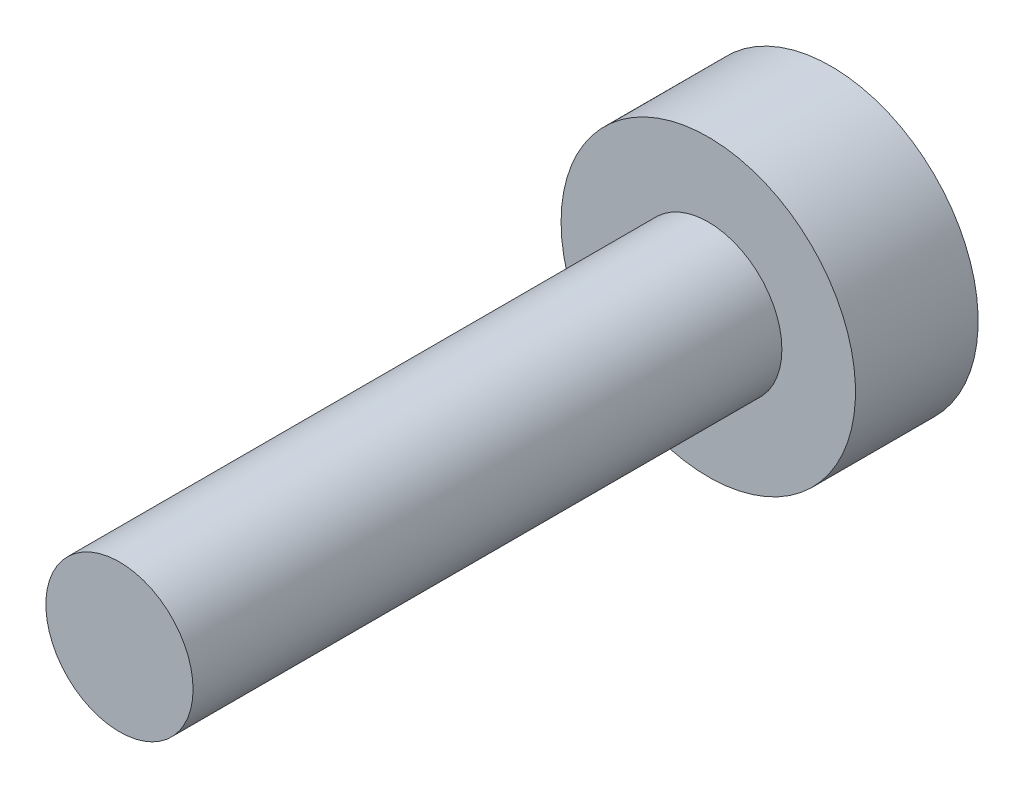
ISO-10303-21;
HEADER;
FILE_DESCRIPTION(('STEP AP214'),'2;1');
FILE_NAME('part.step','',(''),(''),'','','');
FILE_SCHEMA(('AUTOMOTIVE_DESIGN { 1 0 10303 214 1 1 1 1 }'));
ENDSEC;
DATA;
#1=APPLICATION_CONTEXT('core data for automotive mechanical design processes');
#2=APPLICATION_PROTOCOL_DEFINITION('international standard','automotive_design',2000,#1);
#3=PRODUCT_CONTEXT('',#1,'mechanical');
#4=PRODUCT('Part','Part','',(#3));
#5=PRODUCT_RELATED_PRODUCT_CATEGORY('part','',(#4));
#6=PRODUCT_DEFINITION_FORMATION('','',#4);
#7=PRODUCT_DEFINITION_CONTEXT('part definition',#1,'design');
#8=PRODUCT_DEFINITION('design','',#6,#7);
#9=PRODUCT_DEFINITION_SHAPE('','',#8);
#10=(LENGTH_UNIT() NAMED_UNIT(*) SI_UNIT(.MILLI.,.METRE.));
#11=(NAMED_UNIT(*) PLANE_ANGLE_UNIT() SI_UNIT($,.RADIAN.));
#12=(NAMED_UNIT(*) SI_UNIT($,.STERADIAN.) SOLID_ANGLE_UNIT());
#13=UNCERTAINTY_MEASURE_WITH_UNIT(LENGTH_MEASURE(1.E-05),#10,'distance_accuracy_value','');
#14=(GEOMETRIC_REPRESENTATION_CONTEXT(3) GLOBAL_UNCERTAINTY_ASSIGNED_CONTEXT((#13)) GLOBAL_UNIT_ASSIGNED_CONTEXT((#10,
#11,#12)) REPRESENTATION_CONTEXT('',''));
#15=CARTESIAN_POINT('',(0.,0.,0.));
#16=DIRECTION('',(0.,0.,1.));
#17=DIRECTION('',(1.,0.,0.));
#18=AXIS2_PLACEMENT_3D('',#15,#16,#17);
#19=CARTESIAN_POINT('',(-5.94411211869931,3.00621762325022,12.));
#20=DIRECTION('',(0.,0.,-1.));
#21=DIRECTION('',(-1.,0.,0.));
#22=AXIS2_PLACEMENT_3D('',#19,#20,#21);
#23=CYLINDRICAL_SURFACE('',#22,1.5);
#24=CARTESIAN_POINT('',(-5.94411211869931,3.00621762325022,12.));
#25=DIRECTION('',(0.,0.,1.));
#26=DIRECTION('',(1.,0.,0.));
#27=AXIS2_PLACEMENT_3D('',#24,#25,#26);
#28=CIRCLE('',#27,1.5);
#29=CARTESIAN_POINT('',(-4.44411211869931,3.00621762325022,12.));
#30=VERTEX_POINT('',#29);
#31=EDGE_CURVE('E11',#30,#30,#28,.T.);
#32=ORIENTED_EDGE('',*,*,#31,.F.);
#33=EDGE_LOOP('',(#32));
#34=FACE_BOUND('',#33,.T.);
#35=CARTESIAN_POINT('',(-5.94411211869931,3.00621762325022,0.));
#36=DIRECTION('',(0.,0.,1.));
#37=DIRECTION('',(1.,0.,0.));
#38=AXIS2_PLACEMENT_3D('',#35,#36,#37);
#39=CIRCLE('',#38,1.5);
#40=CARTESIAN_POINT('',(-4.44411211869931,3.00621762325022,0.));
#41=VERTEX_POINT('',#40);
#42=EDGE_CURVE('E36',#41,#41,#39,.T.);
#43=ORIENTED_EDGE('',*,*,#42,.T.);
#44=EDGE_LOOP('',(#43));
#45=FACE_BOUND('',#44,.T.);
#46=ADVANCED_FACE('F33',(#34,#45),#23,.T.);
#47=CARTESIAN_POINT('',(-5.94411211869931,3.00621762325022,12.));
#48=DIRECTION('',(0.,0.,1.));
#49=DIRECTION('',(1.,0.,0.));
#50=AXIS2_PLACEMENT_3D('',#47,#48,#49);
#51=PLANE('',#50);
#52=ORIENTED_EDGE('',*,*,#31,.T.);
#53=EDGE_LOOP('',(#52));
#54=FACE_BOUND('',#53,.T.);
#55=ADVANCED_FACE('F229',(#54),#51,.T.);
#56=CARTESIAN_POINT('',(-5.94411211869931,3.00621762325022,-2.5));
#57=DIRECTION('',(0.,0.,1.));
#58=DIRECTION('',(1.,0.,0.));
#59=AXIS2_PLACEMENT_3D('',#56,#57,#58);
#60=CYLINDRICAL_SURFACE('',#59,3.);
#61=CARTESIAN_POINT('',(-5.94411211869931,3.00621762325022,-2.5));
#62=DIRECTION('',(0.,0.,-1.));
#63=DIRECTION('',(-1.,0.,0.));
#64=AXIS2_PLACEMENT_3D('',#61,#62,#63);
#65=CIRCLE('',#64,3.);
#66=CARTESIAN_POINT('',(-8.94411211869931,3.00621762325022,-2.5));
#67=VERTEX_POINT('',#66);
#68=EDGE_CURVE('E204',#67,#67,#65,.T.);
#69=ORIENTED_EDGE('',*,*,#68,.F.);
#70=EDGE_LOOP('',(#69));
#71=FACE_BOUND('',#70,.T.);
#72=CARTESIAN_POINT('',(-5.94411211869931,3.00621762325022,0.));
#73=DIRECTION('',(0.,0.,-1.));
#74=DIRECTION('',(-1.,0.,0.));
#75=AXIS2_PLACEMENT_3D('',#72,#73,#74);
#76=CIRCLE('',#75,3.);
#77=CARTESIAN_POINT('',(-8.94411211869931,3.00621762325022,0.));
#78=VERTEX_POINT('',#77);
#79=EDGE_CURVE('E186',#78,#78,#76,.T.);
#80=ORIENTED_EDGE('',*,*,#79,.T.);
#81=EDGE_LOOP('',(#80));
#82=FACE_BOUND('',#81,.T.);
#83=ADVANCED_FACE('F210',(#71,#82),#60,.T.);
#84=CARTESIAN_POINT('',(-5.94411211869931,3.00621762325022,-2.5));
#85=DIRECTION('',(0.,0.,-1.));
#86=DIRECTION('',(-1.,0.,0.));
#87=AXIS2_PLACEMENT_3D('',#84,#85,#86);
#88=PLANE('',#87);
#89=DIRECTION('',(0.,-1.,0.));
#90=VECTOR('',#89,1.);
#91=CARTESIAN_POINT('',(-3.94411211869931,3.25621762325022,-2.5));
#92=LINE('',#91,#90);
#93=CARTESIAN_POINT('',(-3.94411211869931,3.25621762325022,-2.5));
#94=VERTEX_POINT('',#93);
#95=CARTESIAN_POINT('',(-3.94411211869931,2.75621762325022,-2.5));
#96=VERTEX_POINT('',#95);
#97=EDGE_CURVE('E47',#94,#96,#92,.T.);
#98=ORIENTED_EDGE('',*,*,#97,.F.);
#99=DIRECTION('',(-1.,0.,0.));
#100=VECTOR('',#99,1.);
#101=CARTESIAN_POINT('',(-3.94411211869931,3.25621762325022,-2.5));
#102=LINE('',#101,#100);
#103=CARTESIAN_POINT('',(-5.6941121186993,3.25621762325022,-2.5));
#104=VERTEX_POINT('',#103);
#105=EDGE_CURVE('E181',#94,#104,#102,.T.);
#106=ORIENTED_EDGE('',*,*,#105,.T.);
#107=DIRECTION('',(0.,-1.,0.));
#108=VECTOR('',#107,1.);
#109=CARTESIAN_POINT('',(-5.69411211869928,5.00621762325021,-2.5));
#110=LINE('',#109,#108);
#111=CARTESIAN_POINT('',(-5.69411211869928,5.00621762325021,-2.5));
#112=VERTEX_POINT('',#111);
#113=EDGE_CURVE('E179',#112,#104,#110,.T.);
#114=ORIENTED_EDGE('',*,*,#113,.F.);
#115=DIRECTION('',(-1.,0.,0.));
#116=VECTOR('',#115,1.);
#117=CARTESIAN_POINT('',(-5.69411211869928,5.00621762325021,-2.5));
#118=LINE('',#117,#116);
#119=CARTESIAN_POINT('',(-6.19411211869928,5.00621762325022,-2.5));
#120=VERTEX_POINT('',#119);
#121=EDGE_CURVE('E129',#112,#120,#118,.T.);
#122=ORIENTED_EDGE('',*,*,#121,.T.);
#123=DIRECTION('',(0.,-1.,0.));
#124=VECTOR('',#123,1.);
#125=CARTESIAN_POINT('',(-6.19411211869928,5.00621762325022,-2.5));
#126=LINE('',#125,#124);
#127=CARTESIAN_POINT('',(-6.1941121186993,3.25621762325022,-2.5));
#128=VERTEX_POINT('',#127);
#129=EDGE_CURVE('E175',#120,#128,#126,.T.);
#130=ORIENTED_EDGE('',*,*,#129,.T.);
#131=DIRECTION('',(-1.,0.,0.));
#132=VECTOR('',#131,1.);
#133=CARTESIAN_POINT('',(-6.1941121186993,3.25621762325022,-2.5));
#134=LINE('',#133,#132);
#135=CARTESIAN_POINT('',(-7.94411211869931,3.25621762325022,-2.5));
#136=VERTEX_POINT('',#135);
#137=EDGE_CURVE('E172',#128,#136,#134,.T.);
#138=ORIENTED_EDGE('',*,*,#137,.T.);
#139=DIRECTION('',(0.,-1.,0.));
#140=VECTOR('',#139,1.);
#141=CARTESIAN_POINT('',(-7.94411211869931,3.25621762325022,-2.5));
#142=LINE('',#141,#140);
#143=CARTESIAN_POINT('',(-7.94411211869931,2.75621762325022,-2.5));
#144=VERTEX_POINT('',#143);
#145=EDGE_CURVE('E169',#136,#144,#142,.T.);
#146=ORIENTED_EDGE('',*,*,#145,.T.);
#147=DIRECTION('',(-1.,0.,0.));
#148=VECTOR('',#147,1.);
#149=CARTESIAN_POINT('',(-6.19411211869931,2.75621762325022,-2.5));
#150=LINE('',#149,#148);
#151=CARTESIAN_POINT('',(-6.19411211869931,2.75621762325022,-2.5));
#152=VERTEX_POINT('',#151);
#153=EDGE_CURVE('E166',#152,#144,#150,.T.);
#154=ORIENTED_EDGE('',*,*,#153,.F.);
#155=DIRECTION('',(0.,-1.,0.));
#156=VECTOR('',#155,1.);
#157=CARTESIAN_POINT('',(-6.19411211869931,2.75621762325022,-2.5));
#158=LINE('',#157,#156);
#159=CARTESIAN_POINT('',(-6.19411211869933,1.00621762325022,-2.5));
#160=VERTEX_POINT('',#159);
#161=EDGE_CURVE('E163',#152,#160,#158,.T.);
#162=ORIENTED_EDGE('',*,*,#161,.T.);
#163=DIRECTION('',(-1.,0.,0.));
#164=VECTOR('',#163,1.);
#165=CARTESIAN_POINT('',(-5.69411211869933,1.00621762325021,-2.5));
#166=LINE('',#165,#164);
#167=CARTESIAN_POINT('',(-5.69411211869933,1.00621762325021,-2.5));
#168=VERTEX_POINT('',#167);
#169=EDGE_CURVE('E160',#168,#160,#166,.T.);
#170=ORIENTED_EDGE('',*,*,#169,.F.);
#171=DIRECTION('',(0.,-1.,0.));
#172=VECTOR('',#171,1.);
#173=CARTESIAN_POINT('',(-5.69411211869931,2.75621762325022,-2.5));
#174=LINE('',#173,#172);
#175=CARTESIAN_POINT('',(-5.69411211869931,2.75621762325022,-2.5));
#176=VERTEX_POINT('',#175);
#177=EDGE_CURVE('E157',#176,#168,#174,.T.);
#178=ORIENTED_EDGE('',*,*,#177,.F.);
#179=DIRECTION('',(-1.,0.,0.));
#180=VECTOR('',#179,1.);
#181=CARTESIAN_POINT('',(-3.94411211869931,2.75621762325022,-2.5));
#182=LINE('',#181,#180);
#183=EDGE_CURVE('E154',#96,#176,#182,.T.);
#184=ORIENTED_EDGE('',*,*,#183,.F.);
#185=EDGE_LOOP('',(#98,#106,#114,#122,#130,#138,#146,#154,#162,#170,#178,#184));
#186=FACE_BOUND('',#185,.T.);
#187=ORIENTED_EDGE('',*,*,#68,.T.);
#188=EDGE_LOOP('',(#187));
#189=FACE_BOUND('',#188,.T.);
#190=ADVANCED_FACE('F215',(#186,#189),#88,.T.);
#191=CARTESIAN_POINT('',(-5.94411211869931,3.00621762325022,0.));
#192=DIRECTION('',(0.,0.,-1.));
#193=DIRECTION('',(-1.,0.,0.));
#194=AXIS2_PLACEMENT_3D('',#191,#192,#193);
#195=PLANE('',#194);
#196=ORIENTED_EDGE('',*,*,#42,.F.);
#197=EDGE_LOOP('',(#196));
#198=FACE_BOUND('',#197,.T.);
#199=ORIENTED_EDGE('',*,*,#79,.F.);
#200=EDGE_LOOP('',(#199));
#201=FACE_BOUND('',#200,.T.);
#202=ADVANCED_FACE('F212',(#198,#201),#195,.F.);
#203=CARTESIAN_POINT('',(-3.94411211869931,3.25621762325022,-1.5));
#204=DIRECTION('',(1.,0.,0.));
#205=DIRECTION('',(0.,1.,0.));
#206=AXIS2_PLACEMENT_3D('',#203,#204,#205);
#207=PLANE('',#206);
#208=ORIENTED_EDGE('',*,*,#97,.T.);
#209=DIRECTION('',(0.,0.,-1.));
#210=VECTOR('',#209,1.);
#211=CARTESIAN_POINT('',(-3.94411211869931,2.75621762325022,-1.5));
#212=LINE('',#211,#210);
#213=CARTESIAN_POINT('',(-3.94411211869931,2.75621762325022,-1.5));
#214=VERTEX_POINT('',#213);
#215=EDGE_CURVE('E95',#214,#96,#212,.T.);
#216=ORIENTED_EDGE('',*,*,#215,.F.);
#217=DIRECTION('',(0.,-1.,0.));
#218=VECTOR('',#217,1.);
#219=CARTESIAN_POINT('',(-3.94411211869931,3.25621762325022,-1.5));
#220=LINE('',#219,#218);
#221=CARTESIAN_POINT('',(-3.94411211869931,3.25621762325022,-1.5));
#222=VERTEX_POINT('',#221);
#223=EDGE_CURVE('E184',#222,#214,#220,.T.);
#224=ORIENTED_EDGE('',*,*,#223,.F.);
#225=DIRECTION('',(0.,0.,-1.));
#226=VECTOR('',#225,1.);
#227=CARTESIAN_POINT('',(-3.94411211869931,3.25621762325022,-1.5));
#228=LINE('',#227,#226);
#229=EDGE_CURVE('E55',#222,#94,#228,.T.);
#230=ORIENTED_EDGE('',*,*,#229,.T.);
#231=EDGE_LOOP('',(#208,#216,#224,#230));
#232=FACE_BOUND('',#231,.T.);
#233=ADVANCED_FACE('F214',(#232),#207,.F.);
#234=CARTESIAN_POINT('',(-3.94411211869931,3.25621762325022,-1.5));
#235=DIRECTION('',(0.,-1.,0.));
#236=DIRECTION('',(0.,0.,-1.));
#237=AXIS2_PLACEMENT_3D('',#234,#235,#236);
#238=PLANE('',#237);
#239=ORIENTED_EDGE('',*,*,#105,.F.);
#240=ORIENTED_EDGE('',*,*,#229,.F.);
#241=DIRECTION('',(-1.,0.,0.));
#242=VECTOR('',#241,1.);
#243=CARTESIAN_POINT('',(-3.94411211869931,3.25621762325022,-1.5));
#244=LINE('',#243,#242);
#245=CARTESIAN_POINT('',(-5.6941121186993,3.25621762325022,-1.5));
#246=VERTEX_POINT('',#245);
#247=EDGE_CURVE('E148',#222,#246,#244,.T.);
#248=ORIENTED_EDGE('',*,*,#247,.T.);
#249=DIRECTION('',(0.,0.,-1.));
#250=VECTOR('',#249,1.);
#251=CARTESIAN_POINT('',(-5.6941121186993,3.25621762325022,-1.5));
#252=LINE('',#251,#250);
#253=EDGE_CURVE('E134',#246,#104,#252,.T.);
#254=ORIENTED_EDGE('',*,*,#253,.T.);
#255=EDGE_LOOP('',(#239,#240,#248,#254));
#256=FACE_BOUND('',#255,.T.);
#257=ADVANCED_FACE('F222',(#256),#238,.T.);
#258=CARTESIAN_POINT('',(-5.69411211869928,5.00621762325021,-1.5));
#259=DIRECTION('',(1.,0.,0.));
#260=DIRECTION('',(0.,1.,0.));
#261=AXIS2_PLACEMENT_3D('',#258,#259,#260);
#262=PLANE('',#261);
#263=ORIENTED_EDGE('',*,*,#113,.T.);
#264=ORIENTED_EDGE('',*,*,#253,.F.);
#265=DIRECTION('',(0.,-1.,0.));
#266=VECTOR('',#265,1.);
#267=CARTESIAN_POINT('',(-5.69411211869928,5.00621762325021,-1.5));
#268=LINE('',#267,#266);
#269=CARTESIAN_POINT('',(-5.69411211869928,5.00621762325021,-1.5));
#270=VERTEX_POINT('',#269);
#271=EDGE_CURVE('E142',#270,#246,#268,.T.);
#272=ORIENTED_EDGE('',*,*,#271,.F.);
#273=DIRECTION('',(0.,0.,-1.));
#274=VECTOR('',#273,1.);
#275=CARTESIAN_POINT('',(-5.69411211869928,5.00621762325021,-1.5));
#276=LINE('',#275,#274);
#277=EDGE_CURVE('E123',#270,#112,#276,.T.);
#278=ORIENTED_EDGE('',*,*,#277,.T.);
#279=EDGE_LOOP('',(#263,#264,#272,#278));
#280=FACE_BOUND('',#279,.T.);
#281=ADVANCED_FACE('F147',(#280),#262,.F.);
#282=CARTESIAN_POINT('',(-5.69411211869928,5.00621762325021,-1.5));
#283=DIRECTION('',(0.,-1.,0.));
#284=DIRECTION('',(1.,0.,0.));
#285=AXIS2_PLACEMENT_3D('',#282,#283,#284);
#286=PLANE('',#285);
#287=ORIENTED_EDGE('',*,*,#121,.F.);
#288=ORIENTED_EDGE('',*,*,#277,.F.);
#289=DIRECTION('',(-1.,0.,0.));
#290=VECTOR('',#289,1.);
#291=CARTESIAN_POINT('',(-5.69411211869928,5.00621762325021,-1.5));
#292=LINE('',#291,#290);
#293=CARTESIAN_POINT('',(-6.19411211869928,5.00621762325022,-1.5));
#294=VERTEX_POINT('',#293);
#295=EDGE_CURVE('E126',#270,#294,#292,.T.);
#296=ORIENTED_EDGE('',*,*,#295,.T.);
#297=DIRECTION('',(0.,0.,-1.));
#298=VECTOR('',#297,1.);
#299=CARTESIAN_POINT('',(-6.19411211869928,5.00621762325022,-1.5));
#300=LINE('',#299,#298);
#301=EDGE_CURVE('E135',#294,#120,#300,.T.);
#302=ORIENTED_EDGE('',*,*,#301,.T.);
#303=EDGE_LOOP('',(#287,#288,#296,#302));
#304=FACE_BOUND('',#303,.T.);
#305=ADVANCED_FACE('F125',(#304),#286,.T.);
#306=CARTESIAN_POINT('',(-6.19411211869928,5.00621762325022,-1.5));
#307=DIRECTION('',(1.,0.,0.));
#308=DIRECTION('',(0.,1.,0.));
#309=AXIS2_PLACEMENT_3D('',#306,#307,#308);
#310=PLANE('',#309);
#311=ORIENTED_EDGE('',*,*,#129,.F.);
#312=ORIENTED_EDGE('',*,*,#301,.F.);
#313=DIRECTION('',(0.,-1.,0.));
#314=VECTOR('',#313,1.);
#315=CARTESIAN_POINT('',(-6.19411211869928,5.00621762325022,-1.5));
#316=LINE('',#315,#314);
#317=CARTESIAN_POINT('',(-6.1941121186993,3.25621762325022,-1.5));
#318=VERTEX_POINT('',#317);
#319=EDGE_CURVE('E144',#294,#318,#316,.T.);
#320=ORIENTED_EDGE('',*,*,#319,.T.);
#321=DIRECTION('',(0.,0.,-1.));
#322=VECTOR('',#321,1.);
#323=CARTESIAN_POINT('',(-6.1941121186993,3.25621762325022,-1.5));
#324=LINE('',#323,#322);
#325=EDGE_CURVE('E189',#318,#128,#324,.T.);
#326=ORIENTED_EDGE('',*,*,#325,.T.);
#327=EDGE_LOOP('',(#311,#312,#320,#326));
#328=FACE_BOUND('',#327,.T.);
#329=ADVANCED_FACE('F283',(#328),#310,.T.);
#330=CARTESIAN_POINT('',(-6.1941121186993,3.25621762325022,-1.5));
#331=DIRECTION('',(0.,-1.,0.));
#332=DIRECTION('',(0.,0.,-1.));
#333=AXIS2_PLACEMENT_3D('',#330,#331,#332);
#334=PLANE('',#333);
#335=ORIENTED_EDGE('',*,*,#137,.F.);
#336=ORIENTED_EDGE('',*,*,#325,.F.);
#337=DIRECTION('',(-1.,0.,0.));
#338=VECTOR('',#337,1.);
#339=CARTESIAN_POINT('',(-6.1941121186993,3.25621762325022,-1.5));
#340=LINE('',#339,#338);
#341=CARTESIAN_POINT('',(-7.94411211869931,3.25621762325022,-1.5));
#342=VERTEX_POINT('',#341);
#343=EDGE_CURVE('E397',#318,#342,#340,.T.);
#344=ORIENTED_EDGE('',*,*,#343,.T.);
#345=DIRECTION('',(0.,0.,-1.));
#346=VECTOR('',#345,1.);
#347=CARTESIAN_POINT('',(-7.94411211869931,3.25621762325022,-1.5));
#348=LINE('',#347,#346);
#349=EDGE_CURVE('E191',#342,#136,#348,.T.);
#350=ORIENTED_EDGE('',*,*,#349,.T.);
#351=EDGE_LOOP('',(#335,#336,#344,#350));
#352=FACE_BOUND('',#351,.T.);
#353=ADVANCED_FACE('F292',(#352),#334,.T.);
#354=CARTESIAN_POINT('',(-7.94411211869931,3.25621762325022,-1.5));
#355=DIRECTION('',(1.,0.,0.));
#356=DIRECTION('',(0.,0.,-1.));
#357=AXIS2_PLACEMENT_3D('',#354,#355,#356);
#358=PLANE('',#357);
#359=ORIENTED_EDGE('',*,*,#145,.F.);
#360=ORIENTED_EDGE('',*,*,#349,.F.);
#361=DIRECTION('',(0.,-1.,0.));
#362=VECTOR('',#361,1.);
#363=CARTESIAN_POINT('',(-7.94411211869931,3.25621762325022,-1.5));
#364=LINE('',#363,#362);
#365=CARTESIAN_POINT('',(-7.94411211869931,2.75621762325022,-1.5));
#366=VERTEX_POINT('',#365);
#367=EDGE_CURVE('E395',#342,#366,#364,.T.);
#368=ORIENTED_EDGE('',*,*,#367,.T.);
#369=DIRECTION('',(0.,0.,-1.));
#370=VECTOR('',#369,1.);
#371=CARTESIAN_POINT('',(-7.94411211869931,2.75621762325022,-1.5));
#372=LINE('',#371,#370);
#373=EDGE_CURVE('E193',#366,#144,#372,.T.);
#374=ORIENTED_EDGE('',*,*,#373,.T.);
#375=EDGE_LOOP('',(#359,#360,#368,#374));
#376=FACE_BOUND('',#375,.T.);
#377=ADVANCED_FACE('F302',(#376),#358,.T.);
#378=CARTESIAN_POINT('',(-6.19411211869931,2.75621762325022,-1.5));
#379=DIRECTION('',(0.,-1.,0.));
#380=DIRECTION('',(0.,0.,-1.));
#381=AXIS2_PLACEMENT_3D('',#378,#379,#380);
#382=PLANE('',#381);
#383=ORIENTED_EDGE('',*,*,#153,.T.);
#384=ORIENTED_EDGE('',*,*,#373,.F.);
#385=DIRECTION('',(-1.,0.,0.));
#386=VECTOR('',#385,1.);
#387=CARTESIAN_POINT('',(-6.19411211869931,2.75621762325022,-1.5));
#388=LINE('',#387,#386);
#389=CARTESIAN_POINT('',(-6.19411211869931,2.75621762325022,-1.5));
#390=VERTEX_POINT('',#389);
#391=EDGE_CURVE('E392',#390,#366,#388,.T.);
#392=ORIENTED_EDGE('',*,*,#391,.F.);
#393=DIRECTION('',(0.,0.,-1.));
#394=VECTOR('',#393,1.);
#395=CARTESIAN_POINT('',(-6.19411211869931,2.75621762325022,-1.5));
#396=LINE('',#395,#394);
#397=EDGE_CURVE('E195',#390,#152,#396,.T.);
#398=ORIENTED_EDGE('',*,*,#397,.T.);
#399=EDGE_LOOP('',(#383,#384,#392,#398));
#400=FACE_BOUND('',#399,.T.);
#401=ADVANCED_FACE('F312',(#400),#382,.F.);
#402=CARTESIAN_POINT('',(-6.19411211869931,2.75621762325022,-1.5));
#403=DIRECTION('',(1.,0.,0.));
#404=DIRECTION('',(0.,1.,0.));
#405=AXIS2_PLACEMENT_3D('',#402,#403,#404);
#406=PLANE('',#405);
#407=ORIENTED_EDGE('',*,*,#161,.F.);
#408=ORIENTED_EDGE('',*,*,#397,.F.);
#409=DIRECTION('',(0.,-1.,0.));
#410=VECTOR('',#409,1.);
#411=CARTESIAN_POINT('',(-6.19411211869931,2.75621762325022,-1.5));
#412=LINE('',#411,#410);
#413=CARTESIAN_POINT('',(-6.19411211869933,1.00621762325022,-1.5));
#414=VERTEX_POINT('',#413);
#415=EDGE_CURVE('E390',#390,#414,#412,.T.);
#416=ORIENTED_EDGE('',*,*,#415,.T.);
#417=DIRECTION('',(0.,0.,-1.));
#418=VECTOR('',#417,1.);
#419=CARTESIAN_POINT('',(-6.19411211869933,1.00621762325022,-1.5));
#420=LINE('',#419,#418);
#421=EDGE_CURVE('E197',#414,#160,#420,.T.);
#422=ORIENTED_EDGE('',*,*,#421,.T.);
#423=EDGE_LOOP('',(#407,#408,#416,#422));
#424=FACE_BOUND('',#423,.T.);
#425=ADVANCED_FACE('F322',(#424),#406,.T.);
#426=CARTESIAN_POINT('',(-5.69411211869933,1.00621762325021,-1.5));
#427=DIRECTION('',(0.,-1.,0.));
#428=DIRECTION('',(1.,0.,0.));
#429=AXIS2_PLACEMENT_3D('',#426,#427,#428);
#430=PLANE('',#429);
#431=ORIENTED_EDGE('',*,*,#169,.T.);
#432=ORIENTED_EDGE('',*,*,#421,.F.);
#433=DIRECTION('',(-1.,0.,0.));
#434=VECTOR('',#433,1.);
#435=CARTESIAN_POINT('',(-5.69411211869933,1.00621762325021,-1.5));
#436=LINE('',#435,#434);
#437=CARTESIAN_POINT('',(-5.69411211869933,1.00621762325021,-1.5));
#438=VERTEX_POINT('',#437);
#439=EDGE_CURVE('E383',#438,#414,#436,.T.);
#440=ORIENTED_EDGE('',*,*,#439,.F.);
#441=DIRECTION('',(0.,0.,-1.));
#442=VECTOR('',#441,1.);
#443=CARTESIAN_POINT('',(-5.69411211869933,1.00621762325021,-1.5));
#444=LINE('',#443,#442);
#445=EDGE_CURVE('E199',#438,#168,#444,.T.);
#446=ORIENTED_EDGE('',*,*,#445,.T.);
#447=EDGE_LOOP('',(#431,#432,#440,#446));
#448=FACE_BOUND('',#447,.T.);
#449=ADVANCED_FACE('F332',(#448),#430,.F.);
#450=CARTESIAN_POINT('',(-5.69411211869931,2.75621762325022,-1.5));
#451=DIRECTION('',(1.,0.,0.));
#452=DIRECTION('',(0.,1.,0.));
#453=AXIS2_PLACEMENT_3D('',#450,#451,#452);
#454=PLANE('',#453);
#455=ORIENTED_EDGE('',*,*,#177,.T.);
#456=ORIENTED_EDGE('',*,*,#445,.F.);
#457=DIRECTION('',(0.,-1.,0.));
#458=VECTOR('',#457,1.);
#459=CARTESIAN_POINT('',(-5.69411211869931,2.75621762325022,-1.5));
#460=LINE('',#459,#458);
#461=CARTESIAN_POINT('',(-5.69411211869931,2.75621762325022,-1.5));
#462=VERTEX_POINT('',#461);
#463=EDGE_CURVE('E380',#462,#438,#460,.T.);
#464=ORIENTED_EDGE('',*,*,#463,.F.);
#465=DIRECTION('',(0.,0.,-1.));
#466=VECTOR('',#465,1.);
#467=CARTESIAN_POINT('',(-5.69411211869931,2.75621762325022,-1.5));
#468=LINE('',#467,#466);
#469=EDGE_CURVE('E201',#462,#176,#468,.T.);
#470=ORIENTED_EDGE('',*,*,#469,.T.);
#471=EDGE_LOOP('',(#455,#456,#464,#470));
#472=FACE_BOUND('',#471,.T.);
#473=ADVANCED_FACE('F342',(#472),#454,.F.);
#474=CARTESIAN_POINT('',(-3.94411211869931,2.75621762325022,-1.5));
#475=DIRECTION('',(0.,-1.,0.));
#476=DIRECTION('',(0.,0.,-1.));
#477=AXIS2_PLACEMENT_3D('',#474,#475,#476);
#478=PLANE('',#477);
#479=ORIENTED_EDGE('',*,*,#183,.T.);
#480=ORIENTED_EDGE('',*,*,#469,.F.);
#481=DIRECTION('',(-1.,0.,0.));
#482=VECTOR('',#481,1.);
#483=CARTESIAN_POINT('',(-3.94411211869931,2.75621762325022,-1.5));
#484=LINE('',#483,#482);
#485=EDGE_CURVE('E384',#214,#462,#484,.T.);
#486=ORIENTED_EDGE('',*,*,#485,.F.);
#487=ORIENTED_EDGE('',*,*,#215,.T.);
#488=EDGE_LOOP('',(#479,#480,#486,#487));
#489=FACE_BOUND('',#488,.T.);
#490=ADVANCED_FACE('F352',(#489),#478,.F.);
#491=CARTESIAN_POINT('',(0.,0.,-1.5));
#492=DIRECTION('',(0.,0.,-1.));
#493=DIRECTION('',(-1.,0.,0.));
#494=AXIS2_PLACEMENT_3D('',#491,#492,#493);
#495=PLANE('',#494);
#496=ORIENTED_EDGE('',*,*,#223,.T.);
#497=ORIENTED_EDGE('',*,*,#485,.T.);
#498=ORIENTED_EDGE('',*,*,#463,.T.);
#499=ORIENTED_EDGE('',*,*,#439,.T.);
#500=ORIENTED_EDGE('',*,*,#415,.F.);
#501=ORIENTED_EDGE('',*,*,#391,.T.);
#502=ORIENTED_EDGE('',*,*,#367,.F.);
#503=ORIENTED_EDGE('',*,*,#343,.F.);
#504=ORIENTED_EDGE('',*,*,#319,.F.);
#505=ORIENTED_EDGE('',*,*,#295,.F.);
#506=ORIENTED_EDGE('',*,*,#271,.T.);
#507=ORIENTED_EDGE('',*,*,#247,.F.);
#508=EDGE_LOOP('',(#496,#497,#498,#499,#500,#501,#502,#503,#504,#505,#506,#507));
#509=FACE_BOUND('',#508,.T.);
#510=ADVANCED_FACE('F141',(#509),#495,.T.);
#511=CLOSED_SHELL('',(#46,#55,#83,#190,#202,#233,#257,#281,#305,#329,#353,#377,#401,#425,#449,
#473,#490,#510));
#512=MANIFOLD_SOLID_BREP('B2',#511);
#513=ADVANCED_BREP_SHAPE_REPRESENTATION('',(#18,#512),#14);
#514=SHAPE_DEFINITION_REPRESENTATION(#9,#513);
ENDSEC;
END-ISO-10303-21;
